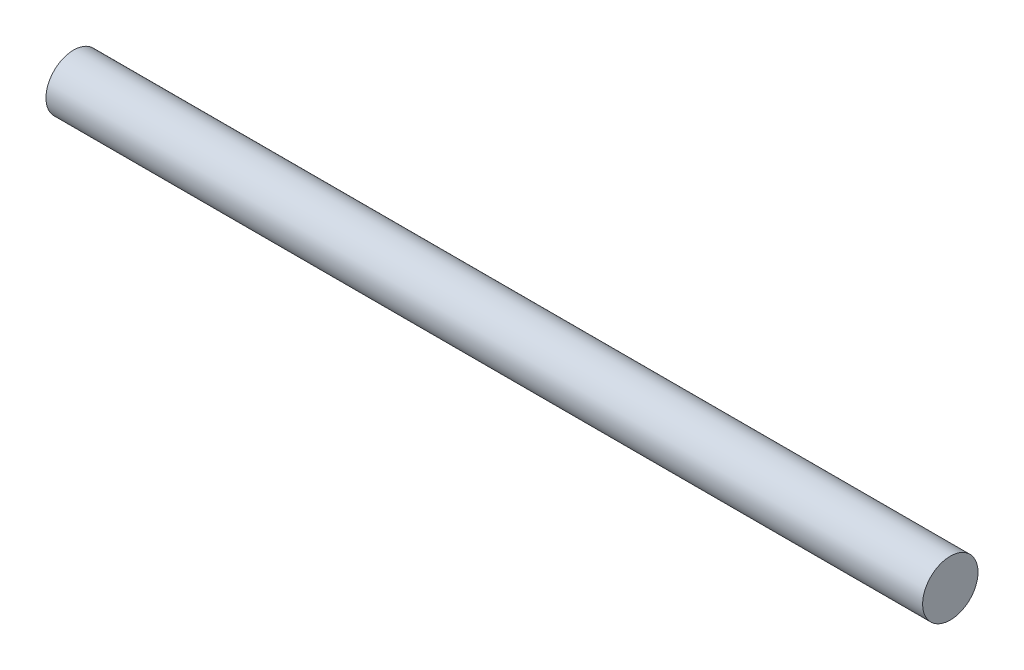
ISO-10303-21;
HEADER;
FILE_DESCRIPTION(('STEP AP214'),'2;1');
FILE_NAME('part.step','',(''),(''),'','','');
FILE_SCHEMA(('AUTOMOTIVE_DESIGN { 1 0 10303 214 1 1 1 1 }'));
ENDSEC;
DATA;
#1=APPLICATION_CONTEXT('core data for automotive mechanical design processes');
#2=APPLICATION_PROTOCOL_DEFINITION('international standard','automotive_design',2000,#1);
#3=PRODUCT_CONTEXT('',#1,'mechanical');
#4=PRODUCT('Part','Part','',(#3));
#5=PRODUCT_RELATED_PRODUCT_CATEGORY('part','',(#4));
#6=PRODUCT_DEFINITION_FORMATION('','',#4);
#7=PRODUCT_DEFINITION_CONTEXT('part definition',#1,'design');
#8=PRODUCT_DEFINITION('design','',#6,#7);
#9=PRODUCT_DEFINITION_SHAPE('','',#8);
#10=(LENGTH_UNIT() NAMED_UNIT(*) SI_UNIT(.MILLI.,.METRE.));
#11=(NAMED_UNIT(*) PLANE_ANGLE_UNIT() SI_UNIT($,.RADIAN.));
#12=(NAMED_UNIT(*) SI_UNIT($,.STERADIAN.) SOLID_ANGLE_UNIT());
#13=UNCERTAINTY_MEASURE_WITH_UNIT(LENGTH_MEASURE(1.E-05),#10,'distance_accuracy_value','');
#14=(GEOMETRIC_REPRESENTATION_CONTEXT(3) GLOBAL_UNCERTAINTY_ASSIGNED_CONTEXT((#13)) GLOBAL_UNIT_ASSIGNED_CONTEXT((#10,
#11,#12)) REPRESENTATION_CONTEXT('',''));
#15=CARTESIAN_POINT('',(0.,0.,0.));
#16=DIRECTION('',(0.,0.,1.));
#17=DIRECTION('',(1.,0.,0.));
#18=AXIS2_PLACEMENT_3D('',#15,#16,#17);
#19=CARTESIAN_POINT('',(38.,0.,0.));
#20=DIRECTION('',(-1.,0.,0.));
#21=DIRECTION('',(0.,0.,1.));
#22=AXIS2_PLACEMENT_3D('',#19,#20,#21);
#23=CYLINDRICAL_SURFACE('',#22,2.4);
#24=CARTESIAN_POINT('',(38.,0.,0.));
#25=DIRECTION('',(1.,0.,0.));
#26=DIRECTION('',(0.,0.,-1.));
#27=AXIS2_PLACEMENT_3D('',#24,#25,#26);
#28=CIRCLE('',#27,2.4);
#29=CARTESIAN_POINT('',(38.,0.,-2.4));
#30=VERTEX_POINT('',#29);
#31=EDGE_CURVE('E10',#30,#30,#28,.T.);
#32=ORIENTED_EDGE('',*,*,#31,.F.);
#33=EDGE_LOOP('',(#32));
#34=FACE_BOUND('',#33,.T.);
#35=CARTESIAN_POINT('',(-38.,0.,0.));
#36=DIRECTION('',(1.,0.,0.));
#37=DIRECTION('',(0.,0.,-1.));
#38=AXIS2_PLACEMENT_3D('',#35,#36,#37);
#39=CIRCLE('',#38,2.4);
#40=CARTESIAN_POINT('',(-38.,0.,-2.4));
#41=VERTEX_POINT('',#40);
#42=EDGE_CURVE('E40',#41,#41,#39,.T.);
#43=ORIENTED_EDGE('',*,*,#42,.T.);
#44=EDGE_LOOP('',(#43));
#45=FACE_BOUND('',#44,.T.);
#46=ADVANCED_FACE('F37',(#34,#45),#23,.T.);
#47=CARTESIAN_POINT('',(38.,0.,0.));
#48=DIRECTION('',(1.,0.,0.));
#49=DIRECTION('',(0.,0.,-1.));
#50=AXIS2_PLACEMENT_3D('',#47,#48,#49);
#51=PLANE('',#50);
#52=ORIENTED_EDGE('',*,*,#31,.T.);
#53=EDGE_LOOP('',(#52));
#54=FACE_BOUND('',#53,.T.);
#55=ADVANCED_FACE('F54',(#54),#51,.T.);
#56=CARTESIAN_POINT('',(-38.,0.,0.));
#57=DIRECTION('',(1.,0.,0.));
#58=DIRECTION('',(0.,0.,-1.));
#59=AXIS2_PLACEMENT_3D('',#56,#57,#58);
#60=PLANE('',#59);
#61=ORIENTED_EDGE('',*,*,#42,.F.);
#62=EDGE_LOOP('',(#61));
#63=FACE_BOUND('',#62,.T.);
#64=ADVANCED_FACE('F52',(#63),#60,.F.);
#65=CLOSED_SHELL('',(#46,#55,#64));
#66=MANIFOLD_SOLID_BREP('B2',#65);
#67=ADVANCED_BREP_SHAPE_REPRESENTATION('',(#18,#66),#14);
#68=SHAPE_DEFINITION_REPRESENTATION(#9,#67);
ENDSEC;
END-ISO-10303-21;
